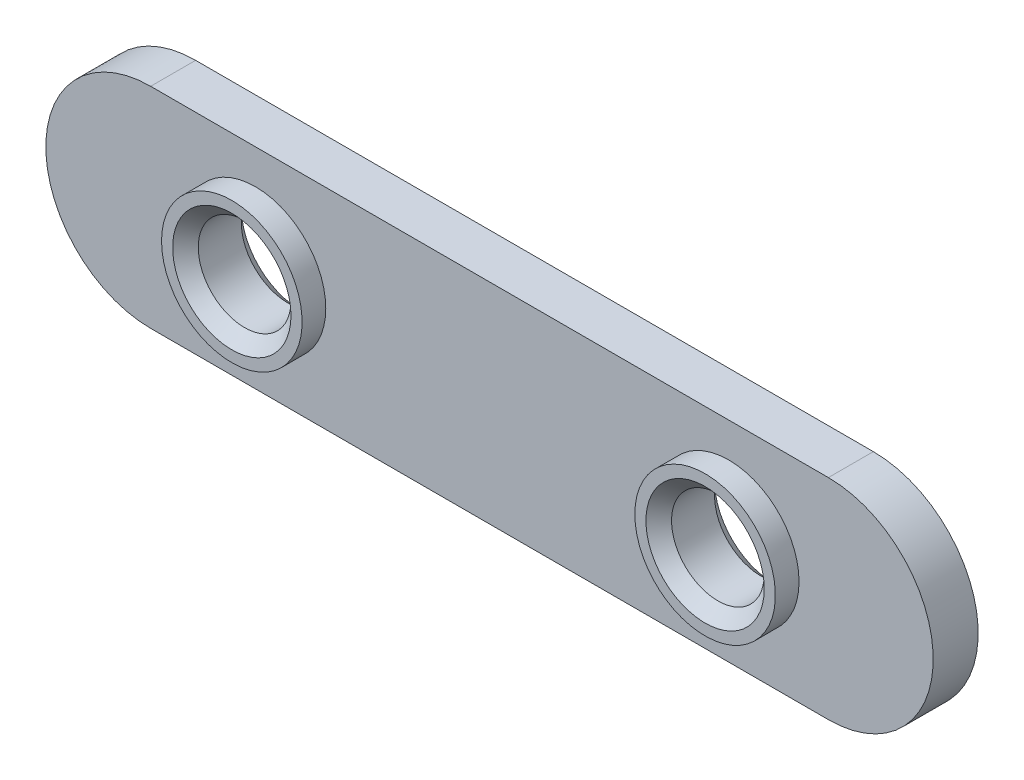
ISO-10303-21;
HEADER;
FILE_DESCRIPTION(('STEP AP214'),'2;1');
FILE_NAME('part.step','',(''),(''),'','','');
FILE_SCHEMA(('AUTOMOTIVE_DESIGN { 1 0 10303 214 1 1 1 1 }'));
ENDSEC;
DATA;
#1=APPLICATION_CONTEXT('core data for automotive mechanical design processes');
#2=APPLICATION_PROTOCOL_DEFINITION('international standard','automotive_design',2000,#1);
#3=PRODUCT_CONTEXT('',#1,'mechanical');
#4=PRODUCT('Part','Part','',(#3));
#5=PRODUCT_RELATED_PRODUCT_CATEGORY('part','',(#4));
#6=PRODUCT_DEFINITION_FORMATION('','',#4);
#7=PRODUCT_DEFINITION_CONTEXT('part definition',#1,'design');
#8=PRODUCT_DEFINITION('design','',#6,#7);
#9=PRODUCT_DEFINITION_SHAPE('','',#8);
#10=(LENGTH_UNIT() NAMED_UNIT(*) SI_UNIT(.MILLI.,.METRE.));
#11=(NAMED_UNIT(*) PLANE_ANGLE_UNIT() SI_UNIT($,.RADIAN.));
#12=(NAMED_UNIT(*) SI_UNIT($,.STERADIAN.) SOLID_ANGLE_UNIT());
#13=UNCERTAINTY_MEASURE_WITH_UNIT(LENGTH_MEASURE(1.E-05),#10,'distance_accuracy_value','');
#14=(GEOMETRIC_REPRESENTATION_CONTEXT(3) GLOBAL_UNCERTAINTY_ASSIGNED_CONTEXT((#13)) GLOBAL_UNIT_ASSIGNED_CONTEXT((#10,
#11,#12)) REPRESENTATION_CONTEXT('',''));
#15=CARTESIAN_POINT('',(0.,0.,0.));
#16=DIRECTION('',(0.,0.,1.));
#17=DIRECTION('',(1.,0.,0.));
#18=AXIS2_PLACEMENT_3D('',#15,#16,#17);
#19=CARTESIAN_POINT('',(30.7467,0.,-1.2065));
#20=DIRECTION('',(0.,0.,1.));
#21=DIRECTION('',(1.,0.,0.));
#22=AXIS2_PLACEMENT_3D('',#19,#20,#21);
#23=CYLINDRICAL_SURFACE('',#22,5.6261);
#24=CARTESIAN_POINT('',(30.7467,0.,1.2065));
#25=DIRECTION('',(0.,0.,1.));
#26=DIRECTION('',(1.,0.,0.));
#27=AXIS2_PLACEMENT_3D('',#24,#25,#26);
#28=CIRCLE('',#27,5.6261);
#29=CARTESIAN_POINT('',(30.7467,-5.6261,1.2065));
#30=VERTEX_POINT('',#29);
#31=CARTESIAN_POINT('',(30.7467,5.6261,1.2065));
#32=VERTEX_POINT('',#31);
#33=EDGE_CURVE('E102',#30,#32,#28,.T.);
#34=ORIENTED_EDGE('',*,*,#33,.F.);
#35=DIRECTION('',(0.,0.,1.));
#36=VECTOR('',#35,1.);
#37=CARTESIAN_POINT('',(30.7467,-5.6261,-1.2065));
#38=LINE('',#37,#36);
#39=CARTESIAN_POINT('',(30.7467,-5.6261,-1.2065));
#40=VERTEX_POINT('',#39);
#41=EDGE_CURVE('E50',#40,#30,#38,.T.);
#42=ORIENTED_EDGE('',*,*,#41,.F.);
#43=CARTESIAN_POINT('',(30.7467,0.,-1.2065));
#44=DIRECTION('',(0.,0.,1.));
#45=DIRECTION('',(1.,0.,0.));
#46=AXIS2_PLACEMENT_3D('',#43,#44,#45);
#47=CIRCLE('',#46,5.6261);
#48=CARTESIAN_POINT('',(30.7467,5.6261,-1.2065));
#49=VERTEX_POINT('',#48);
#50=EDGE_CURVE('E95',#40,#49,#47,.T.);
#51=ORIENTED_EDGE('',*,*,#50,.T.);
#52=DIRECTION('',(0.,0.,1.));
#53=VECTOR('',#52,1.);
#54=CARTESIAN_POINT('',(30.7467,5.6261,-1.2065));
#55=LINE('',#54,#53);
#56=EDGE_CURVE('E78',#49,#32,#55,.T.);
#57=ORIENTED_EDGE('',*,*,#56,.T.);
#58=EDGE_LOOP('',(#34,#42,#51,#57));
#59=FACE_BOUND('',#58,.T.);
#60=ADVANCED_FACE('F33',(#59),#23,.T.);
#61=CARTESIAN_POINT('',(-5.6261,-5.6261,-1.2065));
#62=DIRECTION('',(0.,-1.,0.));
#63=DIRECTION('',(0.,0.,-1.));
#64=AXIS2_PLACEMENT_3D('',#61,#62,#63);
#65=PLANE('',#64);
#66=DIRECTION('',(1.,0.,0.));
#67=VECTOR('',#66,1.);
#68=CARTESIAN_POINT('',(-5.6261,-5.6261,1.2065));
#69=LINE('',#68,#67);
#70=CARTESIAN_POINT('',(-5.6261,-5.6261,1.2065));
#71=VERTEX_POINT('',#70);
#72=EDGE_CURVE('E97',#71,#30,#69,.T.);
#73=ORIENTED_EDGE('',*,*,#72,.F.);
#74=DIRECTION('',(0.,0.,1.));
#75=VECTOR('',#74,1.);
#76=CARTESIAN_POINT('',(-5.6261,-5.6261,-1.2065));
#77=LINE('',#76,#75);
#78=CARTESIAN_POINT('',(-5.6261,-5.6261,-1.2065));
#79=VERTEX_POINT('',#78);
#80=EDGE_CURVE('E67',#79,#71,#77,.T.);
#81=ORIENTED_EDGE('',*,*,#80,.F.);
#82=DIRECTION('',(1.,0.,0.));
#83=VECTOR('',#82,1.);
#84=CARTESIAN_POINT('',(-5.6261,-5.6261,-1.2065));
#85=LINE('',#84,#83);
#86=EDGE_CURVE('E92',#79,#40,#85,.T.);
#87=ORIENTED_EDGE('',*,*,#86,.T.);
#88=ORIENTED_EDGE('',*,*,#41,.T.);
#89=EDGE_LOOP('',(#73,#81,#87,#88));
#90=FACE_BOUND('',#89,.T.);
#91=ADVANCED_FACE('F149',(#90),#65,.T.);
#92=CARTESIAN_POINT('',(-5.6261,0.,-1.2065));
#93=DIRECTION('',(0.,0.,1.));
#94=DIRECTION('',(1.,0.,0.));
#95=AXIS2_PLACEMENT_3D('',#92,#93,#94);
#96=CYLINDRICAL_SURFACE('',#95,5.6261);
#97=CARTESIAN_POINT('',(-5.6261,0.,1.2065));
#98=DIRECTION('',(0.,0.,1.));
#99=DIRECTION('',(1.,0.,0.));
#100=AXIS2_PLACEMENT_3D('',#97,#98,#99);
#101=CIRCLE('',#100,5.6261);
#102=CARTESIAN_POINT('',(-5.6261,5.6261,1.2065));
#103=VERTEX_POINT('',#102);
#104=EDGE_CURVE('E86',#103,#71,#101,.T.);
#105=ORIENTED_EDGE('',*,*,#104,.F.);
#106=DIRECTION('',(0.,0.,1.));
#107=VECTOR('',#106,1.);
#108=CARTESIAN_POINT('',(-5.6261,5.6261,-1.2065));
#109=LINE('',#108,#107);
#110=CARTESIAN_POINT('',(-5.6261,5.6261,-1.2065));
#111=VERTEX_POINT('',#110);
#112=EDGE_CURVE('E81',#111,#103,#109,.T.);
#113=ORIENTED_EDGE('',*,*,#112,.F.);
#114=CARTESIAN_POINT('',(-5.6261,0.,-1.2065));
#115=DIRECTION('',(0.,0.,1.));
#116=DIRECTION('',(1.,0.,0.));
#117=AXIS2_PLACEMENT_3D('',#114,#115,#116);
#118=CIRCLE('',#117,5.6261);
#119=EDGE_CURVE('E84',#111,#79,#118,.T.);
#120=ORIENTED_EDGE('',*,*,#119,.T.);
#121=ORIENTED_EDGE('',*,*,#80,.T.);
#122=EDGE_LOOP('',(#105,#113,#120,#121));
#123=FACE_BOUND('',#122,.T.);
#124=ADVANCED_FACE('F83',(#123),#96,.T.);
#125=CARTESIAN_POINT('',(30.7467,5.6261,-1.2065));
#126=DIRECTION('',(0.,1.,0.));
#127=DIRECTION('',(0.,0.,1.));
#128=AXIS2_PLACEMENT_3D('',#125,#126,#127);
#129=PLANE('',#128);
#130=DIRECTION('',(-1.,0.,0.));
#131=VECTOR('',#130,1.);
#132=CARTESIAN_POINT('',(30.7467,5.6261,1.2065));
#133=LINE('',#132,#131);
#134=EDGE_CURVE('E105',#32,#103,#133,.T.);
#135=ORIENTED_EDGE('',*,*,#134,.F.);
#136=ORIENTED_EDGE('',*,*,#56,.F.);
#137=DIRECTION('',(-1.,0.,0.));
#138=VECTOR('',#137,1.);
#139=CARTESIAN_POINT('',(30.7467,5.6261,-1.2065));
#140=LINE('',#139,#138);
#141=EDGE_CURVE('E91',#49,#111,#140,.T.);
#142=ORIENTED_EDGE('',*,*,#141,.T.);
#143=ORIENTED_EDGE('',*,*,#112,.T.);
#144=EDGE_LOOP('',(#135,#136,#142,#143));
#145=FACE_BOUND('',#144,.T.);
#146=ADVANCED_FACE('F94',(#145),#129,.T.);
#147=CARTESIAN_POINT('',(30.7467,0.,-1.2065));
#148=DIRECTION('',(0.,0.,1.));
#149=DIRECTION('',(1.,0.,0.));
#150=AXIS2_PLACEMENT_3D('',#147,#148,#149);
#151=PLANE('',#150);
#152=CARTESIAN_POINT('',(25.4,0.,-1.2065));
#153=DIRECTION('',(0.,0.,1.));
#154=DIRECTION('',(1.,0.,0.));
#155=AXIS2_PLACEMENT_3D('',#152,#153,#154);
#156=CIRCLE('',#155,3.17499999999998);
#157=CARTESIAN_POINT('',(28.575,0.,-1.2065));
#158=VERTEX_POINT('',#157);
#159=EDGE_CURVE('E123',#158,#158,#156,.T.);
#160=ORIENTED_EDGE('',*,*,#159,.T.);
#161=EDGE_LOOP('',(#160));
#162=FACE_BOUND('',#161,.T.);
#163=CARTESIAN_POINT('',(0.,0.,-1.2065));
#164=DIRECTION('',(0.,0.,1.));
#165=DIRECTION('',(1.,0.,0.));
#166=AXIS2_PLACEMENT_3D('',#163,#164,#165);
#167=CIRCLE('',#166,3.17499999999999);
#168=CARTESIAN_POINT('',(3.17499999999999,0.,-1.2065));
#169=VERTEX_POINT('',#168);
#170=EDGE_CURVE('E120',#169,#169,#167,.T.);
#171=ORIENTED_EDGE('',*,*,#170,.T.);
#172=EDGE_LOOP('',(#171));
#173=FACE_BOUND('',#172,.T.);
#174=ORIENTED_EDGE('',*,*,#50,.F.);
#175=ORIENTED_EDGE('',*,*,#86,.F.);
#176=ORIENTED_EDGE('',*,*,#119,.F.);
#177=ORIENTED_EDGE('',*,*,#141,.F.);
#178=EDGE_LOOP('',(#174,#175,#176,#177));
#179=FACE_BOUND('',#178,.T.);
#180=ADVANCED_FACE('F90',(#162,#173,#179),#151,.F.);
#181=CARTESIAN_POINT('',(30.7467,0.,1.2065));
#182=DIRECTION('',(0.,0.,1.));
#183=DIRECTION('',(1.,0.,0.));
#184=AXIS2_PLACEMENT_3D('',#181,#182,#183);
#185=PLANE('',#184);
#186=CARTESIAN_POINT('',(25.4,0.,1.2065));
#187=DIRECTION('',(0.,0.,1.));
#188=DIRECTION('',(1.,0.,0.));
#189=AXIS2_PLACEMENT_3D('',#186,#187,#188);
#190=CIRCLE('',#189,3.7719);
#191=CARTESIAN_POINT('',(29.1719,0.,1.2065));
#192=VERTEX_POINT('',#191);
#193=EDGE_CURVE('E117',#192,#192,#190,.T.);
#194=ORIENTED_EDGE('',*,*,#193,.F.);
#195=EDGE_LOOP('',(#194));
#196=FACE_BOUND('',#195,.T.);
#197=CARTESIAN_POINT('',(0.,0.,1.2065));
#198=DIRECTION('',(0.,0.,1.));
#199=DIRECTION('',(1.,0.,0.));
#200=AXIS2_PLACEMENT_3D('',#197,#198,#199);
#201=CIRCLE('',#200,3.7719);
#202=CARTESIAN_POINT('',(3.7719,0.,1.2065));
#203=VERTEX_POINT('',#202);
#204=EDGE_CURVE('E112',#203,#203,#201,.T.);
#205=ORIENTED_EDGE('',*,*,#204,.F.);
#206=EDGE_LOOP('',(#205));
#207=FACE_BOUND('',#206,.T.);
#208=ORIENTED_EDGE('',*,*,#33,.T.);
#209=ORIENTED_EDGE('',*,*,#134,.T.);
#210=ORIENTED_EDGE('',*,*,#104,.T.);
#211=ORIENTED_EDGE('',*,*,#72,.T.);
#212=EDGE_LOOP('',(#208,#209,#210,#211));
#213=FACE_BOUND('',#212,.T.);
#214=ADVANCED_FACE('F139',(#196,#207,#213),#185,.T.);
#215=CARTESIAN_POINT('',(0.,0.,2.4765));
#216=DIRECTION('',(0.,0.,-1.));
#217=DIRECTION('',(-1.,0.,0.));
#218=AXIS2_PLACEMENT_3D('',#215,#216,#217);
#219=CYLINDRICAL_SURFACE('',#218,3.7719);
#220=CARTESIAN_POINT('',(0.,0.,2.4765));
#221=DIRECTION('',(0.,0.,-1.));
#222=DIRECTION('',(-1.,0.,0.));
#223=AXIS2_PLACEMENT_3D('',#220,#221,#222);
#224=CIRCLE('',#223,3.7719);
#225=CARTESIAN_POINT('',(-3.7719,0.,2.4765));
#226=VERTEX_POINT('',#225);
#227=EDGE_CURVE('E106',#226,#226,#224,.T.);
#228=ORIENTED_EDGE('',*,*,#227,.T.);
#229=EDGE_LOOP('',(#228));
#230=FACE_BOUND('',#229,.T.);
#231=ORIENTED_EDGE('',*,*,#204,.T.);
#232=EDGE_LOOP('',(#231));
#233=FACE_BOUND('',#232,.T.);
#234=ADVANCED_FACE('F161',(#230,#233),#219,.T.);
#235=CARTESIAN_POINT('',(3.7719,0.,2.4765));
#236=DIRECTION('',(0.,0.,1.));
#237=DIRECTION('',(1.,0.,0.));
#238=AXIS2_PLACEMENT_3D('',#235,#236,#237);
#239=PLANE('',#238);
#240=CARTESIAN_POINT('',(0.,0.,2.4765));
#241=DIRECTION('',(0.,0.,1.));
#242=DIRECTION('',(1.,0.,0.));
#243=AXIS2_PLACEMENT_3D('',#240,#241,#242);
#244=CIRCLE('',#243,3.175);
#245=CARTESIAN_POINT('',(3.175,0.,2.4765));
#246=VERTEX_POINT('',#245);
#247=EDGE_CURVE('E199',#246,#246,#244,.T.);
#248=ORIENTED_EDGE('',*,*,#247,.F.);
#249=EDGE_LOOP('',(#248));
#250=FACE_BOUND('',#249,.T.);
#251=ORIENTED_EDGE('',*,*,#227,.F.);
#252=EDGE_LOOP('',(#251));
#253=FACE_BOUND('',#252,.T.);
#254=ADVANCED_FACE('F166',(#250,#253),#239,.T.);
#255=CARTESIAN_POINT('',(25.4,0.,2.4765));
#256=DIRECTION('',(0.,0.,-1.));
#257=DIRECTION('',(-1.,0.,0.));
#258=AXIS2_PLACEMENT_3D('',#255,#256,#257);
#259=CYLINDRICAL_SURFACE('',#258,3.7719);
#260=CARTESIAN_POINT('',(25.4,0.,2.4765));
#261=DIRECTION('',(0.,0.,-1.));
#262=DIRECTION('',(-1.,0.,0.));
#263=AXIS2_PLACEMENT_3D('',#260,#261,#262);
#264=CIRCLE('',#263,3.7719);
#265=CARTESIAN_POINT('',(21.6281,0.,2.4765));
#266=VERTEX_POINT('',#265);
#267=EDGE_CURVE('E209',#266,#266,#264,.T.);
#268=ORIENTED_EDGE('',*,*,#267,.T.);
#269=EDGE_LOOP('',(#268));
#270=FACE_BOUND('',#269,.T.);
#271=ORIENTED_EDGE('',*,*,#193,.T.);
#272=EDGE_LOOP('',(#271));
#273=FACE_BOUND('',#272,.T.);
#274=ADVANCED_FACE('F170',(#270,#273),#259,.T.);
#275=CARTESIAN_POINT('',(29.1719,0.,2.4765));
#276=DIRECTION('',(0.,0.,1.));
#277=DIRECTION('',(1.,0.,0.));
#278=AXIS2_PLACEMENT_3D('',#275,#276,#277);
#279=PLANE('',#278);
#280=CARTESIAN_POINT('',(25.4,0.,2.4765));
#281=DIRECTION('',(0.,0.,1.));
#282=DIRECTION('',(1.,0.,0.));
#283=AXIS2_PLACEMENT_3D('',#280,#281,#282);
#284=CIRCLE('',#283,3.175);
#285=CARTESIAN_POINT('',(28.575,0.,2.4765));
#286=VERTEX_POINT('',#285);
#287=EDGE_CURVE('E201',#286,#286,#284,.T.);
#288=ORIENTED_EDGE('',*,*,#287,.F.);
#289=EDGE_LOOP('',(#288));
#290=FACE_BOUND('',#289,.T.);
#291=ORIENTED_EDGE('',*,*,#267,.F.);
#292=EDGE_LOOP('',(#291));
#293=FACE_BOUND('',#292,.T.);
#294=ADVANCED_FACE('F174',(#290,#293),#279,.T.);
#295=CARTESIAN_POINT('',(25.4,0.,2.4765));
#296=DIRECTION('',(0.,0.,1.));
#297=DIRECTION('',(1.,0.,0.));
#298=AXIS2_PLACEMENT_3D('',#295,#296,#297);
#299=CYLINDRICAL_SURFACE('',#298,2.48793000000001);
#300=CARTESIAN_POINT('',(25.4,0.,-0.519430000000012));
#301=DIRECTION('',(0.,0.,1.));
#302=DIRECTION('',(1.,0.,0.));
#303=AXIS2_PLACEMENT_3D('',#300,#301,#302);
#304=CIRCLE('',#303,2.48793000000001);
#305=CARTESIAN_POINT('',(27.88793,0.,-0.519430000000012));
#306=VERTEX_POINT('',#305);
#307=EDGE_CURVE('E42',#306,#306,#304,.F.);
#308=ORIENTED_EDGE('',*,*,#307,.T.);
#309=EDGE_LOOP('',(#308));
#310=FACE_BOUND('',#309,.T.);
#311=CARTESIAN_POINT('',(25.4,0.,1.78943000000003));
#312=DIRECTION('',(0.,0.,1.));
#313=DIRECTION('',(1.,0.,0.));
#314=AXIS2_PLACEMENT_3D('',#311,#312,#313);
#315=CIRCLE('',#314,2.48793000000001);
#316=CARTESIAN_POINT('',(27.88793,0.,1.78943000000003));
#317=VERTEX_POINT('',#316);
#318=EDGE_CURVE('E206',#317,#317,#315,.T.);
#319=ORIENTED_EDGE('',*,*,#318,.T.);
#320=EDGE_LOOP('',(#319));
#321=FACE_BOUND('',#320,.T.);
#322=ADVANCED_FACE('F128',(#310,#321),#299,.F.);
#323=CARTESIAN_POINT('',(25.4,0.,2.4765));
#324=DIRECTION('',(0.,0.,1.));
#325=DIRECTION('',(1.,0.,0.));
#326=AXIS2_PLACEMENT_3D('',#323,#324,#325);
#327=CONICAL_SURFACE('',#326,3.175,0.78539816339746);
#328=ORIENTED_EDGE('',*,*,#318,.F.);
#329=EDGE_LOOP('',(#328));
#330=FACE_BOUND('',#329,.T.);
#331=ORIENTED_EDGE('',*,*,#287,.T.);
#332=EDGE_LOOP('',(#331));
#333=FACE_BOUND('',#332,.T.);
#334=ADVANCED_FACE('F181',(#330,#333),#327,.F.);
#335=CARTESIAN_POINT('',(0.,0.,2.4765));
#336=DIRECTION('',(0.,0.,1.));
#337=DIRECTION('',(1.,0.,0.));
#338=AXIS2_PLACEMENT_3D('',#335,#336,#337);
#339=CYLINDRICAL_SURFACE('',#338,2.48793000000001);
#340=CARTESIAN_POINT('',(0.,0.,-0.519430000000011));
#341=DIRECTION('',(0.,0.,1.));
#342=DIRECTION('',(1.,0.,0.));
#343=AXIS2_PLACEMENT_3D('',#340,#341,#342);
#344=CIRCLE('',#343,2.48793000000001);
#345=CARTESIAN_POINT('',(2.48793000000001,0.,-0.519430000000011));
#346=VERTEX_POINT('',#345);
#347=EDGE_CURVE('E11',#346,#346,#344,.F.);
#348=ORIENTED_EDGE('',*,*,#347,.T.);
#349=EDGE_LOOP('',(#348));
#350=FACE_BOUND('',#349,.T.);
#351=CARTESIAN_POINT('',(0.,0.,1.78943000000003));
#352=DIRECTION('',(0.,0.,1.));
#353=DIRECTION('',(1.,0.,0.));
#354=AXIS2_PLACEMENT_3D('',#351,#352,#353);
#355=CIRCLE('',#354,2.48793000000001);
#356=CARTESIAN_POINT('',(2.48793000000001,0.,1.78943000000003));
#357=VERTEX_POINT('',#356);
#358=EDGE_CURVE('E196',#357,#357,#355,.T.);
#359=ORIENTED_EDGE('',*,*,#358,.T.);
#360=EDGE_LOOP('',(#359));
#361=FACE_BOUND('',#360,.T.);
#362=ADVANCED_FACE('F184',(#350,#361),#339,.F.);
#363=CARTESIAN_POINT('',(0.,0.,2.4765));
#364=DIRECTION('',(0.,0.,1.));
#365=DIRECTION('',(1.,0.,0.));
#366=AXIS2_PLACEMENT_3D('',#363,#364,#365);
#367=CONICAL_SURFACE('',#366,3.175,0.785398163397461);
#368=ORIENTED_EDGE('',*,*,#358,.F.);
#369=EDGE_LOOP('',(#368));
#370=FACE_BOUND('',#369,.T.);
#371=ORIENTED_EDGE('',*,*,#247,.T.);
#372=EDGE_LOOP('',(#371));
#373=FACE_BOUND('',#372,.T.);
#374=ADVANCED_FACE('F134',(#370,#373),#367,.F.);
#375=CARTESIAN_POINT('',(25.4,0.,-1.2065));
#376=DIRECTION('',(0.,0.,-1.));
#377=DIRECTION('',(-1.,0.,0.));
#378=AXIS2_PLACEMENT_3D('',#375,#376,#377);
#379=CONICAL_SURFACE('',#378,3.17499999999998,0.78539816339744);
#380=ORIENTED_EDGE('',*,*,#307,.F.);
#381=EDGE_LOOP('',(#380));
#382=FACE_BOUND('',#381,.T.);
#383=ORIENTED_EDGE('',*,*,#159,.F.);
#384=EDGE_LOOP('',(#383));
#385=FACE_BOUND('',#384,.T.);
#386=ADVANCED_FACE('F131',(#382,#385),#379,.F.);
#387=CARTESIAN_POINT('',(0.,0.,-1.2065));
#388=DIRECTION('',(0.,0.,-1.));
#389=DIRECTION('',(-1.,0.,0.));
#390=AXIS2_PLACEMENT_3D('',#387,#388,#389);
#391=CONICAL_SURFACE('',#390,3.17499999999999,0.785398163397445);
#392=ORIENTED_EDGE('',*,*,#347,.F.);
#393=EDGE_LOOP('',(#392));
#394=FACE_BOUND('',#393,.T.);
#395=ORIENTED_EDGE('',*,*,#170,.F.);
#396=EDGE_LOOP('',(#395));
#397=FACE_BOUND('',#396,.T.);
#398=ADVANCED_FACE('F35',(#394,#397),#391,.F.);
#399=CLOSED_SHELL('',(#60,#91,#124,#146,#180,#214,#234,#254,#274,#294,#322,#334,#362,#374,#386,#398));
#400=MANIFOLD_SOLID_BREP('B2',#399);
#401=ADVANCED_BREP_SHAPE_REPRESENTATION('',(#18,#400),#14);
#402=SHAPE_DEFINITION_REPRESENTATION(#9,#401);
ENDSEC;
END-ISO-10303-21;
